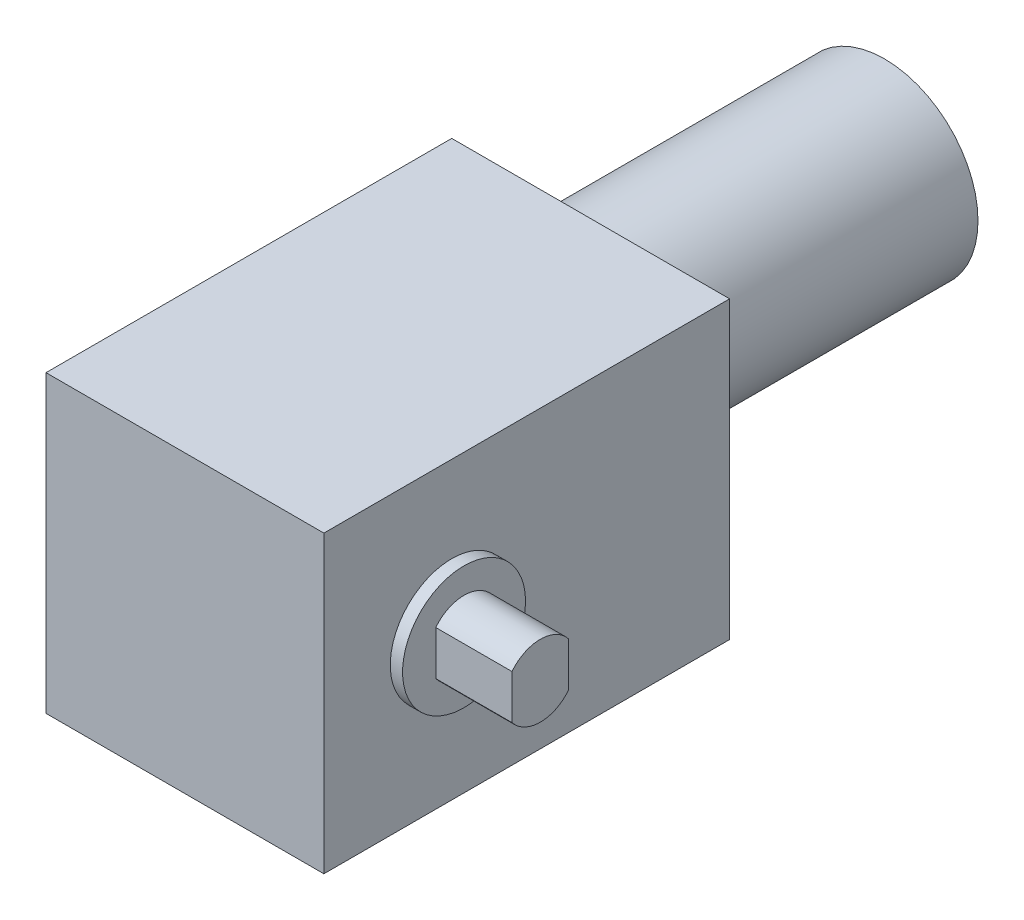
ISO-10303-21;
HEADER;
FILE_DESCRIPTION(('STEP AP214'),'2;1');
FILE_NAME('part.step','',(''),(''),'','','');
FILE_SCHEMA(('AUTOMOTIVE_DESIGN { 1 0 10303 214 1 1 1 1 }'));
ENDSEC;
DATA;
#1=APPLICATION_CONTEXT('core data for automotive mechanical design processes');
#2=APPLICATION_PROTOCOL_DEFINITION('international standard','automotive_design',2000,#1);
#3=PRODUCT_CONTEXT('',#1,'mechanical');
#4=PRODUCT('Part','Part','',(#3));
#5=PRODUCT_RELATED_PRODUCT_CATEGORY('part','',(#4));
#6=PRODUCT_DEFINITION_FORMATION('','',#4);
#7=PRODUCT_DEFINITION_CONTEXT('part definition',#1,'design');
#8=PRODUCT_DEFINITION('design','',#6,#7);
#9=PRODUCT_DEFINITION_SHAPE('','',#8);
#10=(LENGTH_UNIT() NAMED_UNIT(*) SI_UNIT(.MILLI.,.METRE.));
#11=(NAMED_UNIT(*) PLANE_ANGLE_UNIT() SI_UNIT($,.RADIAN.));
#12=(NAMED_UNIT(*) SI_UNIT($,.STERADIAN.) SOLID_ANGLE_UNIT());
#13=UNCERTAINTY_MEASURE_WITH_UNIT(LENGTH_MEASURE(1.E-05),#10,'distance_accuracy_value','');
#14=(GEOMETRIC_REPRESENTATION_CONTEXT(3) GLOBAL_UNCERTAINTY_ASSIGNED_CONTEXT((#13)) GLOBAL_UNIT_ASSIGNED_CONTEXT((#10,
#11,#12)) REPRESENTATION_CONTEXT('',''));
#15=CARTESIAN_POINT('',(0.,0.,0.));
#16=DIRECTION('',(0.,0.,1.));
#17=DIRECTION('',(1.,0.,0.));
#18=AXIS2_PLACEMENT_3D('',#15,#16,#17);
#19=CARTESIAN_POINT('',(-11.3,-6.,5.2));
#20=DIRECTION('',(1.,0.,0.));
#21=DIRECTION('',(0.,0.,-1.));
#22=AXIS2_PLACEMENT_3D('',#19,#20,#21);
#23=PLANE('',#22);
#24=DIRECTION('',(0.,-1.,0.));
#25=VECTOR('',#24,1.);
#26=CARTESIAN_POINT('',(-11.3,6.,5.2));
#27=LINE('',#26,#25);
#28=CARTESIAN_POINT('',(-11.3,6.,5.2));
#29=VERTEX_POINT('',#28);
#30=CARTESIAN_POINT('',(-11.3,-6.,5.2));
#31=VERTEX_POINT('',#30);
#32=EDGE_CURVE('E124',#29,#31,#27,.T.);
#33=ORIENTED_EDGE('',*,*,#32,.F.);
#34=DIRECTION('',(0.,0.,1.));
#35=VECTOR('',#34,1.);
#36=CARTESIAN_POINT('',(-11.3,6.,5.2));
#37=LINE('',#36,#35);
#38=CARTESIAN_POINT('',(-11.3,6.,-11.3));
#39=VERTEX_POINT('',#38);
#40=EDGE_CURVE('E117',#39,#29,#37,.T.);
#41=ORIENTED_EDGE('',*,*,#40,.F.);
#42=DIRECTION('',(0.,1.,0.));
#43=VECTOR('',#42,1.);
#44=CARTESIAN_POINT('',(-11.3,6.,-11.3));
#45=LINE('',#44,#43);
#46=CARTESIAN_POINT('',(-11.3,0.,-11.3));
#47=VERTEX_POINT('',#46);
#48=EDGE_CURVE('E118',#47,#39,#45,.T.);
#49=ORIENTED_EDGE('',*,*,#48,.F.);
#50=CARTESIAN_POINT('',(-11.3,-6.,-11.3));
#51=VERTEX_POINT('',#50);
#52=EDGE_CURVE('E109',#51,#47,#45,.T.);
#53=ORIENTED_EDGE('',*,*,#52,.F.);
#54=DIRECTION('',(0.,0.,-1.));
#55=VECTOR('',#54,1.);
#56=CARTESIAN_POINT('',(-11.3,-6.,5.2));
#57=LINE('',#56,#55);
#58=EDGE_CURVE('E123',#31,#51,#57,.T.);
#59=ORIENTED_EDGE('',*,*,#58,.F.);
#60=EDGE_LOOP('',(#33,#41,#49,#53,#59));
#61=FACE_BOUND('',#60,.T.);
#62=CARTESIAN_POINT('',(-11.3,0.,-5.3));
#63=DIRECTION('',(1.,0.,0.));
#64=DIRECTION('',(0.,0.,-1.));
#65=AXIS2_PLACEMENT_3D('',#62,#63,#64);
#66=CIRCLE('',#65,1.25);
#67=CARTESIAN_POINT('',(-11.3,0.,-6.55));
#68=VERTEX_POINT('',#67);
#69=EDGE_CURVE('E11',#68,#68,#66,.F.);
#70=ORIENTED_EDGE('',*,*,#69,.F.);
#71=EDGE_LOOP('',(#70));
#72=FACE_BOUND('',#71,.T.);
#73=ADVANCED_FACE('F32',(#61,#72),#23,.F.);
#74=CARTESIAN_POINT('',(0.5,0.,0.));
#75=DIRECTION('',(1.,0.,0.));
#76=DIRECTION('',(0.,0.,-1.));
#77=AXIS2_PLACEMENT_3D('',#74,#75,#76);
#78=PLANE('',#77);
#79=CARTESIAN_POINT('',(0.5,0.,0.));
#80=DIRECTION('',(1.,0.,0.));
#81=DIRECTION('',(0.,0.,-1.));
#82=AXIS2_PLACEMENT_3D('',#79,#80,#81);
#83=CIRCLE('',#82,2.5);
#84=CARTESIAN_POINT('',(0.5,0.,-2.5));
#85=VERTEX_POINT('',#84);
#86=EDGE_CURVE('E133',#85,#85,#83,.T.);
#87=ORIENTED_EDGE('',*,*,#86,.T.);
#88=EDGE_LOOP('',(#87));
#89=FACE_BOUND('',#88,.T.);
#90=DIRECTION('',(0.,-1.,0.));
#91=VECTOR('',#90,1.);
#92=CARTESIAN_POINT('',(0.5,0.899499861033897,1.15));
#93=LINE('',#92,#91);
#94=CARTESIAN_POINT('',(0.5,0.899499861033897,1.15));
#95=VERTEX_POINT('',#94);
#96=CARTESIAN_POINT('',(0.5,-0.899499861033897,1.15));
#97=VERTEX_POINT('',#96);
#98=EDGE_CURVE('E325',#95,#97,#93,.T.);
#99=ORIENTED_EDGE('',*,*,#98,.F.);
#100=CARTESIAN_POINT('',(0.5,0.,0.));
#101=DIRECTION('',(1.,0.,0.));
#102=DIRECTION('',(0.,0.,-1.));
#103=AXIS2_PLACEMENT_3D('',#100,#101,#102);
#104=CIRCLE('',#103,1.46);
#105=CARTESIAN_POINT('',(0.5,0.899499861033898,-1.15));
#106=VERTEX_POINT('',#105);
#107=EDGE_CURVE('E310',#106,#95,#104,.T.);
#108=ORIENTED_EDGE('',*,*,#107,.F.);
#109=DIRECTION('',(0.,1.,0.));
#110=VECTOR('',#109,1.);
#111=CARTESIAN_POINT('',(0.5,0.899499861033898,-1.15));
#112=LINE('',#111,#110);
#113=CARTESIAN_POINT('',(0.5,-0.899499861033897,-1.15));
#114=VERTEX_POINT('',#113);
#115=EDGE_CURVE('E316',#114,#106,#112,.T.);
#116=ORIENTED_EDGE('',*,*,#115,.F.);
#117=CARTESIAN_POINT('',(0.5,0.,0.));
#118=DIRECTION('',(1.,0.,0.));
#119=DIRECTION('',(0.,0.,-1.));
#120=AXIS2_PLACEMENT_3D('',#117,#118,#119);
#121=CIRCLE('',#120,1.46);
#122=EDGE_CURVE('E327',#97,#114,#121,.T.);
#123=ORIENTED_EDGE('',*,*,#122,.F.);
#124=EDGE_LOOP('',(#99,#108,#116,#123));
#125=FACE_BOUND('',#124,.T.);
#126=ADVANCED_FACE('F159',(#89,#125),#78,.T.);
#127=CARTESIAN_POINT('',(0.,-6.,5.2));
#128=DIRECTION('',(1.,0.,0.));
#129=DIRECTION('',(0.,0.,-1.));
#130=AXIS2_PLACEMENT_3D('',#127,#128,#129);
#131=PLANE('',#130);
#132=DIRECTION('',(0.,-1.,0.));
#133=VECTOR('',#132,1.);
#134=CARTESIAN_POINT('',(0.,6.,5.2));
#135=LINE('',#134,#133);
#136=CARTESIAN_POINT('',(0.,6.,5.2));
#137=VERTEX_POINT('',#136);
#138=CARTESIAN_POINT('',(0.,-6.,5.2));
#139=VERTEX_POINT('',#138);
#140=EDGE_CURVE('E129',#137,#139,#135,.T.);
#141=ORIENTED_EDGE('',*,*,#140,.T.);
#142=DIRECTION('',(0.,0.,-1.));
#143=VECTOR('',#142,1.);
#144=CARTESIAN_POINT('',(0.,-6.,5.2));
#145=LINE('',#144,#143);
#146=CARTESIAN_POINT('',(0.,-6.,-11.3));
#147=VERTEX_POINT('',#146);
#148=EDGE_CURVE('E132',#139,#147,#145,.T.);
#149=ORIENTED_EDGE('',*,*,#148,.T.);
#150=DIRECTION('',(0.,1.,0.));
#151=VECTOR('',#150,1.);
#152=CARTESIAN_POINT('',(0.,6.,-11.3));
#153=LINE('',#152,#151);
#154=CARTESIAN_POINT('',(0.,6.,-11.3));
#155=VERTEX_POINT('',#154);
#156=EDGE_CURVE('E136',#147,#155,#153,.T.);
#157=ORIENTED_EDGE('',*,*,#156,.T.);
#158=DIRECTION('',(0.,0.,1.));
#159=VECTOR('',#158,1.);
#160=CARTESIAN_POINT('',(0.,6.,5.2));
#161=LINE('',#160,#159);
#162=EDGE_CURVE('E139',#155,#137,#161,.T.);
#163=ORIENTED_EDGE('',*,*,#162,.T.);
#164=EDGE_LOOP('',(#141,#149,#157,#163));
#165=FACE_BOUND('',#164,.T.);
#166=CARTESIAN_POINT('',(0.,0.,0.));
#167=DIRECTION('',(1.,0.,0.));
#168=DIRECTION('',(0.,0.,-1.));
#169=AXIS2_PLACEMENT_3D('',#166,#167,#168);
#170=CIRCLE('',#169,2.5);
#171=CARTESIAN_POINT('',(0.,0.,-2.5));
#172=VERTEX_POINT('',#171);
#173=EDGE_CURVE('E338',#172,#172,#170,.T.);
#174=ORIENTED_EDGE('',*,*,#173,.F.);
#175=EDGE_LOOP('',(#174));
#176=FACE_BOUND('',#175,.T.);
#177=ADVANCED_FACE('F147',(#165,#176),#131,.T.);
#178=CARTESIAN_POINT('',(-11.3,6.,5.2));
#179=DIRECTION('',(0.,0.,1.));
#180=DIRECTION('',(1.,0.,0.));
#181=AXIS2_PLACEMENT_3D('',#178,#179,#180);
#182=PLANE('',#181);
#183=ORIENTED_EDGE('',*,*,#140,.F.);
#184=DIRECTION('',(1.,0.,0.));
#185=VECTOR('',#184,1.);
#186=CARTESIAN_POINT('',(-11.3,6.,5.2));
#187=LINE('',#186,#185);
#188=EDGE_CURVE('E40',#29,#137,#187,.T.);
#189=ORIENTED_EDGE('',*,*,#188,.F.);
#190=ORIENTED_EDGE('',*,*,#32,.T.);
#191=DIRECTION('',(1.,0.,0.));
#192=VECTOR('',#191,1.);
#193=CARTESIAN_POINT('',(-11.3,-6.,5.2));
#194=LINE('',#193,#192);
#195=EDGE_CURVE('E81',#31,#139,#194,.T.);
#196=ORIENTED_EDGE('',*,*,#195,.T.);
#197=EDGE_LOOP('',(#183,#189,#190,#196));
#198=FACE_BOUND('',#197,.T.);
#199=ADVANCED_FACE('F34',(#198),#182,.T.);
#200=CARTESIAN_POINT('',(-11.3,6.,5.2));
#201=DIRECTION('',(0.,1.,0.));
#202=DIRECTION('',(0.,0.,1.));
#203=AXIS2_PLACEMENT_3D('',#200,#201,#202);
#204=PLANE('',#203);
#205=ORIENTED_EDGE('',*,*,#162,.F.);
#206=DIRECTION('',(1.,0.,0.));
#207=VECTOR('',#206,1.);
#208=CARTESIAN_POINT('',(-11.3,6.,-11.3));
#209=LINE('',#208,#207);
#210=EDGE_CURVE('E143',#39,#155,#209,.T.);
#211=ORIENTED_EDGE('',*,*,#210,.F.);
#212=ORIENTED_EDGE('',*,*,#40,.T.);
#213=ORIENTED_EDGE('',*,*,#188,.T.);
#214=EDGE_LOOP('',(#205,#211,#212,#213));
#215=FACE_BOUND('',#214,.T.);
#216=ADVANCED_FACE('F149',(#215),#204,.T.);
#217=CARTESIAN_POINT('',(-11.3,6.,-11.3));
#218=DIRECTION('',(0.,0.,-1.));
#219=DIRECTION('',(-1.,0.,0.));
#220=AXIS2_PLACEMENT_3D('',#217,#218,#219);
#221=PLANE('',#220);
#222=ORIENTED_EDGE('',*,*,#52,.T.);
#223=CARTESIAN_POINT('',(-7.5,0.,-11.3));
#224=DIRECTION('',(0.,0.,-1.));
#225=DIRECTION('',(-1.,0.,0.));
#226=AXIS2_PLACEMENT_3D('',#223,#224,#225);
#227=CIRCLE('',#226,3.8);
#228=EDGE_CURVE('E113',#47,#47,#227,.T.);
#229=ORIENTED_EDGE('',*,*,#228,.F.);
#230=ORIENTED_EDGE('',*,*,#48,.T.);
#231=ORIENTED_EDGE('',*,*,#210,.T.);
#232=ORIENTED_EDGE('',*,*,#156,.F.);
#233=DIRECTION('',(1.,0.,0.));
#234=VECTOR('',#233,1.);
#235=CARTESIAN_POINT('',(-11.3,-6.,-11.3));
#236=LINE('',#235,#234);
#237=EDGE_CURVE('E115',#51,#147,#236,.T.);
#238=ORIENTED_EDGE('',*,*,#237,.F.);
#239=EDGE_LOOP('',(#222,#229,#230,#231,#232,#238));
#240=FACE_BOUND('',#239,.T.);
#241=ADVANCED_FACE('F111',(#240),#221,.T.);
#242=CARTESIAN_POINT('',(-11.3,-6.,5.2));
#243=DIRECTION('',(0.,-1.,0.));
#244=DIRECTION('',(0.,0.,-1.));
#245=AXIS2_PLACEMENT_3D('',#242,#243,#244);
#246=PLANE('',#245);
#247=ORIENTED_EDGE('',*,*,#148,.F.);
#248=ORIENTED_EDGE('',*,*,#195,.F.);
#249=ORIENTED_EDGE('',*,*,#58,.T.);
#250=ORIENTED_EDGE('',*,*,#237,.T.);
#251=EDGE_LOOP('',(#247,#248,#249,#250));
#252=FACE_BOUND('',#251,.T.);
#253=ADVANCED_FACE('F145',(#252),#246,.T.);
#254=CARTESIAN_POINT('',(0.5,0.,0.));
#255=DIRECTION('',(-1.,0.,0.));
#256=DIRECTION('',(0.,0.,1.));
#257=AXIS2_PLACEMENT_3D('',#254,#255,#256);
#258=CYLINDRICAL_SURFACE('',#257,2.5);
#259=ORIENTED_EDGE('',*,*,#86,.F.);
#260=EDGE_LOOP('',(#259));
#261=FACE_BOUND('',#260,.T.);
#262=ORIENTED_EDGE('',*,*,#173,.T.);
#263=EDGE_LOOP('',(#262));
#264=FACE_BOUND('',#263,.T.);
#265=ADVANCED_FACE('F167',(#261,#264),#258,.T.);
#266=CARTESIAN_POINT('',(3.6,0.,0.));
#267=DIRECTION('',(-1.,0.,0.));
#268=DIRECTION('',(0.,0.,1.));
#269=AXIS2_PLACEMENT_3D('',#266,#267,#268);
#270=CYLINDRICAL_SURFACE('',#269,1.46);
#271=ORIENTED_EDGE('',*,*,#107,.T.);
#272=DIRECTION('',(-1.,0.,0.));
#273=VECTOR('',#272,1.);
#274=CARTESIAN_POINT('',(3.6,0.899499861033897,1.15));
#275=LINE('',#274,#273);
#276=CARTESIAN_POINT('',(3.6,0.899499861033897,1.15));
#277=VERTEX_POINT('',#276);
#278=EDGE_CURVE('E336',#277,#95,#275,.T.);
#279=ORIENTED_EDGE('',*,*,#278,.F.);
#280=CARTESIAN_POINT('',(3.6,0.,0.));
#281=DIRECTION('',(1.,0.,0.));
#282=DIRECTION('',(0.,0.,-1.));
#283=AXIS2_PLACEMENT_3D('',#280,#281,#282);
#284=CIRCLE('',#283,1.46);
#285=CARTESIAN_POINT('',(3.6,0.899499861033898,-1.15));
#286=VERTEX_POINT('',#285);
#287=EDGE_CURVE('E312',#286,#277,#284,.T.);
#288=ORIENTED_EDGE('',*,*,#287,.F.);
#289=DIRECTION('',(-1.,0.,0.));
#290=VECTOR('',#289,1.);
#291=CARTESIAN_POINT('',(3.6,0.899499861033898,-1.15));
#292=LINE('',#291,#290);
#293=EDGE_CURVE('E322',#286,#106,#292,.T.);
#294=ORIENTED_EDGE('',*,*,#293,.T.);
#295=EDGE_LOOP('',(#271,#279,#288,#294));
#296=FACE_BOUND('',#295,.T.);
#297=ADVANCED_FACE('F199',(#296),#270,.T.);
#298=CARTESIAN_POINT('',(3.6,0.899499861033897,1.15));
#299=DIRECTION('',(0.,0.,-1.));
#300=DIRECTION('',(-1.,0.,0.));
#301=AXIS2_PLACEMENT_3D('',#298,#299,#300);
#302=PLANE('',#301);
#303=ORIENTED_EDGE('',*,*,#98,.T.);
#304=DIRECTION('',(-1.,0.,0.));
#305=VECTOR('',#304,1.);
#306=CARTESIAN_POINT('',(3.6,-0.899499861033897,1.15));
#307=LINE('',#306,#305);
#308=CARTESIAN_POINT('',(3.6,-0.899499861033897,1.15));
#309=VERTEX_POINT('',#308);
#310=EDGE_CURVE('E333',#309,#97,#307,.T.);
#311=ORIENTED_EDGE('',*,*,#310,.F.);
#312=DIRECTION('',(0.,-1.,0.));
#313=VECTOR('',#312,1.);
#314=CARTESIAN_POINT('',(3.6,0.899499861033897,1.15));
#315=LINE('',#314,#313);
#316=EDGE_CURVE('E315',#277,#309,#315,.T.);
#317=ORIENTED_EDGE('',*,*,#316,.F.);
#318=ORIENTED_EDGE('',*,*,#278,.T.);
#319=EDGE_LOOP('',(#303,#311,#317,#318));
#320=FACE_BOUND('',#319,.T.);
#321=ADVANCED_FACE('F206',(#320),#302,.F.);
#322=CARTESIAN_POINT('',(3.6,0.,0.));
#323=DIRECTION('',(-1.,0.,0.));
#324=DIRECTION('',(0.,0.,1.));
#325=AXIS2_PLACEMENT_3D('',#322,#323,#324);
#326=CYLINDRICAL_SURFACE('',#325,1.46);
#327=ORIENTED_EDGE('',*,*,#122,.T.);
#328=DIRECTION('',(-1.,0.,0.));
#329=VECTOR('',#328,1.);
#330=CARTESIAN_POINT('',(3.6,-0.899499861033897,-1.15));
#331=LINE('',#330,#329);
#332=CARTESIAN_POINT('',(3.6,-0.899499861033897,-1.15));
#333=VERTEX_POINT('',#332);
#334=EDGE_CURVE('E47',#333,#114,#331,.T.);
#335=ORIENTED_EDGE('',*,*,#334,.F.);
#336=CARTESIAN_POINT('',(3.6,0.,0.));
#337=DIRECTION('',(1.,0.,0.));
#338=DIRECTION('',(0.,0.,-1.));
#339=AXIS2_PLACEMENT_3D('',#336,#337,#338);
#340=CIRCLE('',#339,1.46);
#341=EDGE_CURVE('E318',#309,#333,#340,.T.);
#342=ORIENTED_EDGE('',*,*,#341,.F.);
#343=ORIENTED_EDGE('',*,*,#310,.T.);
#344=EDGE_LOOP('',(#327,#335,#342,#343));
#345=FACE_BOUND('',#344,.T.);
#346=ADVANCED_FACE('F214',(#345),#326,.T.);
#347=CARTESIAN_POINT('',(3.6,0.899499861033898,-1.15));
#348=DIRECTION('',(0.,0.,1.));
#349=DIRECTION('',(0.,-1.,0.));
#350=AXIS2_PLACEMENT_3D('',#347,#348,#349);
#351=PLANE('',#350);
#352=ORIENTED_EDGE('',*,*,#115,.T.);
#353=ORIENTED_EDGE('',*,*,#293,.F.);
#354=DIRECTION('',(0.,1.,0.));
#355=VECTOR('',#354,1.);
#356=CARTESIAN_POINT('',(3.6,0.899499861033898,-1.15));
#357=LINE('',#356,#355);
#358=EDGE_CURVE('E320',#333,#286,#357,.T.);
#359=ORIENTED_EDGE('',*,*,#358,.F.);
#360=ORIENTED_EDGE('',*,*,#334,.T.);
#361=EDGE_LOOP('',(#352,#353,#359,#360));
#362=FACE_BOUND('',#361,.T.);
#363=ADVANCED_FACE('F222',(#362),#351,.F.);
#364=CARTESIAN_POINT('',(3.6,0.,0.));
#365=DIRECTION('',(1.,0.,0.));
#366=DIRECTION('',(0.,0.,-1.));
#367=AXIS2_PLACEMENT_3D('',#364,#365,#366);
#368=PLANE('',#367);
#369=ORIENTED_EDGE('',*,*,#287,.T.);
#370=ORIENTED_EDGE('',*,*,#316,.T.);
#371=ORIENTED_EDGE('',*,*,#341,.T.);
#372=ORIENTED_EDGE('',*,*,#358,.T.);
#373=EDGE_LOOP('',(#369,#370,#371,#372));
#374=FACE_BOUND('',#373,.T.);
#375=ADVANCED_FACE('F230',(#374),#368,.T.);
#376=CARTESIAN_POINT('',(-7.5,0.,-25.1));
#377=DIRECTION('',(0.,0.,1.));
#378=DIRECTION('',(1.,0.,0.));
#379=AXIS2_PLACEMENT_3D('',#376,#377,#378);
#380=CYLINDRICAL_SURFACE('',#379,3.8);
#381=CARTESIAN_POINT('',(-7.5,0.,-25.1));
#382=DIRECTION('',(0.,0.,-1.));
#383=DIRECTION('',(-1.,0.,0.));
#384=AXIS2_PLACEMENT_3D('',#381,#382,#383);
#385=CIRCLE('',#384,3.8);
#386=CARTESIAN_POINT('',(-11.3,0.,-25.1));
#387=VERTEX_POINT('',#386);
#388=EDGE_CURVE('E306',#387,#387,#385,.T.);
#389=ORIENTED_EDGE('',*,*,#388,.F.);
#390=EDGE_LOOP('',(#389));
#391=FACE_BOUND('',#390,.T.);
#392=ORIENTED_EDGE('',*,*,#228,.T.);
#393=EDGE_LOOP('',(#392));
#394=FACE_BOUND('',#393,.T.);
#395=ADVANCED_FACE('F237',(#391,#394),#380,.T.);
#396=CARTESIAN_POINT('',(-7.5,0.,-25.1));
#397=DIRECTION('',(0.,0.,-1.));
#398=DIRECTION('',(-1.,0.,0.));
#399=AXIS2_PLACEMENT_3D('',#396,#397,#398);
#400=PLANE('',#399);
#401=ORIENTED_EDGE('',*,*,#388,.T.);
#402=EDGE_LOOP('',(#401));
#403=FACE_BOUND('',#402,.T.);
#404=ADVANCED_FACE('F245',(#403),#400,.T.);
#405=CARTESIAN_POINT('',(-11.7,0.,-5.3));
#406=DIRECTION('',(1.,0.,0.));
#407=DIRECTION('',(0.,0.,-1.));
#408=AXIS2_PLACEMENT_3D('',#405,#406,#407);
#409=CYLINDRICAL_SURFACE('',#408,1.25);
#410=CARTESIAN_POINT('',(-11.7,0.,-5.3));
#411=DIRECTION('',(-1.,0.,0.));
#412=DIRECTION('',(0.,0.,1.));
#413=AXIS2_PLACEMENT_3D('',#410,#411,#412);
#414=CIRCLE('',#413,1.25);
#415=CARTESIAN_POINT('',(-11.7,0.,-4.05));
#416=VERTEX_POINT('',#415);
#417=EDGE_CURVE('E304',#416,#416,#414,.T.);
#418=ORIENTED_EDGE('',*,*,#417,.F.);
#419=EDGE_LOOP('',(#418));
#420=FACE_BOUND('',#419,.T.);
#421=ORIENTED_EDGE('',*,*,#69,.T.);
#422=EDGE_LOOP('',(#421));
#423=FACE_BOUND('',#422,.T.);
#424=ADVANCED_FACE('F253',(#420,#423),#409,.T.);
#425=CARTESIAN_POINT('',(-11.7,0.,-5.3));
#426=DIRECTION('',(-1.,0.,0.));
#427=DIRECTION('',(0.,0.,1.));
#428=AXIS2_PLACEMENT_3D('',#425,#426,#427);
#429=PLANE('',#428);
#430=ORIENTED_EDGE('',*,*,#417,.T.);
#431=EDGE_LOOP('',(#430));
#432=FACE_BOUND('',#431,.T.);
#433=ADVANCED_FACE('F261',(#432),#429,.T.);
#434=CLOSED_SHELL('',(#73,#126,#177,#199,#216,#241,#253,#265,#297,#321,#346,#363,#375,#395,#404,
#424,#433));
#435=MANIFOLD_SOLID_BREP('B2',#434);
#436=ADVANCED_BREP_SHAPE_REPRESENTATION('',(#18,#435),#14);
#437=SHAPE_DEFINITION_REPRESENTATION(#9,#436);
ENDSEC;
END-ISO-10303-21;
